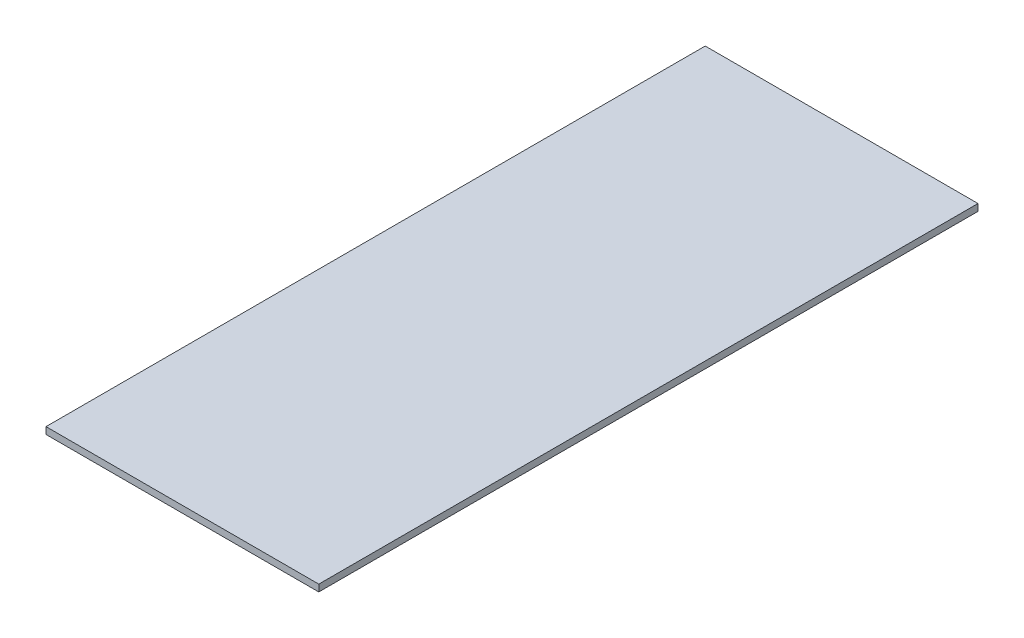
ISO-10303-21;
HEADER;
FILE_DESCRIPTION(('STEP AP214'),'2;1');
FILE_NAME('part.step','',(''),(''),'','','');
FILE_SCHEMA(('AUTOMOTIVE_DESIGN { 1 0 10303 214 1 1 1 1 }'));
ENDSEC;
DATA;
#1=APPLICATION_CONTEXT('core data for automotive mechanical design processes');
#2=APPLICATION_PROTOCOL_DEFINITION('international standard','automotive_design',2000,#1);
#3=PRODUCT_CONTEXT('',#1,'mechanical');
#4=PRODUCT('Part','Part','',(#3));
#5=PRODUCT_RELATED_PRODUCT_CATEGORY('part','',(#4));
#6=PRODUCT_DEFINITION_FORMATION('','',#4);
#7=PRODUCT_DEFINITION_CONTEXT('part definition',#1,'design');
#8=PRODUCT_DEFINITION('design','',#6,#7);
#9=PRODUCT_DEFINITION_SHAPE('','',#8);
#10=(LENGTH_UNIT() NAMED_UNIT(*) SI_UNIT(.MILLI.,.METRE.));
#11=(NAMED_UNIT(*) PLANE_ANGLE_UNIT() SI_UNIT($,.RADIAN.));
#12=(NAMED_UNIT(*) SI_UNIT($,.STERADIAN.) SOLID_ANGLE_UNIT());
#13=UNCERTAINTY_MEASURE_WITH_UNIT(LENGTH_MEASURE(1.E-05),#10,'distance_accuracy_value','');
#14=(GEOMETRIC_REPRESENTATION_CONTEXT(3) GLOBAL_UNCERTAINTY_ASSIGNED_CONTEXT((#13)) GLOBAL_UNIT_ASSIGNED_CONTEXT((#10,
#11,#12)) REPRESENTATION_CONTEXT('',''));
#15=CARTESIAN_POINT('',(0.,0.,0.));
#16=DIRECTION('',(0.,0.,1.));
#17=DIRECTION('',(1.,0.,0.));
#18=AXIS2_PLACEMENT_3D('',#15,#16,#17);
#19=CARTESIAN_POINT('',(-44.040471128325,3.,-45.34731003421));
#20=DIRECTION('',(1.,0.,0.));
#21=DIRECTION('',(0.,0.,-1.));
#22=AXIS2_PLACEMENT_3D('',#19,#20,#21);
#23=PLANE('',#22);
#24=DIRECTION('',(0.,0.,1.));
#25=VECTOR('',#24,1.);
#26=CARTESIAN_POINT('',(-44.040471128325,0.,-45.34731003421));
#27=LINE('',#26,#25);
#28=CARTESIAN_POINT('',(-44.040471128325,0.,-45.34731003421));
#29=VERTEX_POINT('',#28);
#30=CARTESIAN_POINT('',(-44.040471128325,0.,244.65268996579));
#31=VERTEX_POINT('',#30);
#32=EDGE_CURVE('E104',#29,#31,#27,.T.);
#33=ORIENTED_EDGE('',*,*,#32,.T.);
#34=DIRECTION('',(0.,-1.,0.));
#35=VECTOR('',#34,1.);
#36=CARTESIAN_POINT('',(-44.040471128325,3.,244.65268996579));
#37=LINE('',#36,#35);
#38=CARTESIAN_POINT('',(-44.040471128325,3.,244.65268996579));
#39=VERTEX_POINT('',#38);
#40=EDGE_CURVE('E11',#39,#31,#37,.T.);
#41=ORIENTED_EDGE('',*,*,#40,.F.);
#42=DIRECTION('',(0.,0.,1.));
#43=VECTOR('',#42,1.);
#44=CARTESIAN_POINT('',(-44.040471128325,3.,-45.34731003421));
#45=LINE('',#44,#43);
#46=CARTESIAN_POINT('',(-44.040471128325,3.,-45.34731003421));
#47=VERTEX_POINT('',#46);
#48=EDGE_CURVE('E92',#47,#39,#45,.T.);
#49=ORIENTED_EDGE('',*,*,#48,.F.);
#50=DIRECTION('',(0.,-1.,0.));
#51=VECTOR('',#50,1.);
#52=CARTESIAN_POINT('',(-44.040471128325,3.,-45.34731003421));
#53=LINE('',#52,#51);
#54=EDGE_CURVE('E100',#47,#29,#53,.T.);
#55=ORIENTED_EDGE('',*,*,#54,.T.);
#56=EDGE_LOOP('',(#33,#41,#49,#55));
#57=FACE_BOUND('',#56,.T.);
#58=ADVANCED_FACE('F41',(#57),#23,.F.);
#59=CARTESIAN_POINT('',(-44.040471128325,3.,244.65268996579));
#60=DIRECTION('',(0.,0.,-1.));
#61=DIRECTION('',(-1.,0.,0.));
#62=AXIS2_PLACEMENT_3D('',#59,#60,#61);
#63=PLANE('',#62);
#64=DIRECTION('',(1.,0.,0.));
#65=VECTOR('',#64,1.);
#66=CARTESIAN_POINT('',(-44.040471128325,0.,244.65268996579));
#67=LINE('',#66,#65);
#68=CARTESIAN_POINT('',(75.959528871675,0.,244.65268996579));
#69=VERTEX_POINT('',#68);
#70=EDGE_CURVE('E96',#31,#69,#67,.T.);
#71=ORIENTED_EDGE('',*,*,#70,.T.);
#72=DIRECTION('',(0.,-1.,0.));
#73=VECTOR('',#72,1.);
#74=CARTESIAN_POINT('',(75.959528871675,3.,244.65268996579));
#75=LINE('',#74,#73);
#76=CARTESIAN_POINT('',(75.959528871675,3.,244.65268996579));
#77=VERTEX_POINT('',#76);
#78=EDGE_CURVE('E49',#77,#69,#75,.T.);
#79=ORIENTED_EDGE('',*,*,#78,.F.);
#80=DIRECTION('',(1.,0.,0.));
#81=VECTOR('',#80,1.);
#82=CARTESIAN_POINT('',(-44.040471128325,3.,244.65268996579));
#83=LINE('',#82,#81);
#84=EDGE_CURVE('E87',#39,#77,#83,.T.);
#85=ORIENTED_EDGE('',*,*,#84,.F.);
#86=ORIENTED_EDGE('',*,*,#40,.T.);
#87=EDGE_LOOP('',(#71,#79,#85,#86));
#88=FACE_BOUND('',#87,.T.);
#89=ADVANCED_FACE('F95',(#88),#63,.F.);
#90=CARTESIAN_POINT('',(75.9595288716749,3.,-45.34731003421));
#91=DIRECTION('',(-1.,0.,0.));
#92=DIRECTION('',(0.,0.,1.));
#93=AXIS2_PLACEMENT_3D('',#90,#91,#92);
#94=PLANE('',#93);
#95=DIRECTION('',(0.,0.,-1.));
#96=VECTOR('',#95,1.);
#97=CARTESIAN_POINT('',(75.9595288716749,0.,-45.34731003421));
#98=LINE('',#97,#96);
#99=CARTESIAN_POINT('',(75.9595288716749,0.,-45.34731003421));
#100=VERTEX_POINT('',#99);
#101=EDGE_CURVE('E74',#69,#100,#98,.T.);
#102=ORIENTED_EDGE('',*,*,#101,.T.);
#103=DIRECTION('',(0.,-1.,0.));
#104=VECTOR('',#103,1.);
#105=CARTESIAN_POINT('',(75.9595288716749,3.,-45.34731003421));
#106=LINE('',#105,#104);
#107=CARTESIAN_POINT('',(75.9595288716749,3.,-45.34731003421));
#108=VERTEX_POINT('',#107);
#109=EDGE_CURVE('E97',#108,#100,#106,.T.);
#110=ORIENTED_EDGE('',*,*,#109,.F.);
#111=DIRECTION('',(0.,0.,-1.));
#112=VECTOR('',#111,1.);
#113=CARTESIAN_POINT('',(75.9595288716749,3.,-45.34731003421));
#114=LINE('',#113,#112);
#115=EDGE_CURVE('E90',#77,#108,#114,.T.);
#116=ORIENTED_EDGE('',*,*,#115,.F.);
#117=ORIENTED_EDGE('',*,*,#78,.T.);
#118=EDGE_LOOP('',(#102,#110,#116,#117));
#119=FACE_BOUND('',#118,.T.);
#120=ADVANCED_FACE('F98',(#119),#94,.F.);
#121=CARTESIAN_POINT('',(-44.040471128325,3.,-45.34731003421));
#122=DIRECTION('',(0.,0.,1.));
#123=DIRECTION('',(1.,0.,0.));
#124=AXIS2_PLACEMENT_3D('',#121,#122,#123);
#125=PLANE('',#124);
#126=DIRECTION('',(-1.,0.,0.));
#127=VECTOR('',#126,1.);
#128=CARTESIAN_POINT('',(-44.040471128325,0.,-45.34731003421));
#129=LINE('',#128,#127);
#130=EDGE_CURVE('E80',#100,#29,#129,.T.);
#131=ORIENTED_EDGE('',*,*,#130,.T.);
#132=ORIENTED_EDGE('',*,*,#54,.F.);
#133=DIRECTION('',(-1.,0.,0.));
#134=VECTOR('',#133,1.);
#135=CARTESIAN_POINT('',(-44.040471128325,3.,-45.34731003421));
#136=LINE('',#135,#134);
#137=EDGE_CURVE('E57',#108,#47,#136,.T.);
#138=ORIENTED_EDGE('',*,*,#137,.F.);
#139=ORIENTED_EDGE('',*,*,#109,.T.);
#140=EDGE_LOOP('',(#131,#132,#138,#139));
#141=FACE_BOUND('',#140,.T.);
#142=ADVANCED_FACE('F111',(#141),#125,.F.);
#143=CARTESIAN_POINT('',(0.,3.,0.));
#144=DIRECTION('',(0.,1.,0.));
#145=DIRECTION('',(0.,0.,1.));
#146=AXIS2_PLACEMENT_3D('',#143,#144,#145);
#147=PLANE('',#146);
#148=ORIENTED_EDGE('',*,*,#48,.T.);
#149=ORIENTED_EDGE('',*,*,#84,.T.);
#150=ORIENTED_EDGE('',*,*,#115,.T.);
#151=ORIENTED_EDGE('',*,*,#137,.T.);
#152=EDGE_LOOP('',(#148,#149,#150,#151));
#153=FACE_BOUND('',#152,.T.);
#154=ADVANCED_FACE('F88',(#153),#147,.T.);
#155=CARTESIAN_POINT('',(0.,0.,0.));
#156=DIRECTION('',(0.,1.,0.));
#157=DIRECTION('',(0.,0.,1.));
#158=AXIS2_PLACEMENT_3D('',#155,#156,#157);
#159=PLANE('',#158);
#160=ORIENTED_EDGE('',*,*,#32,.F.);
#161=ORIENTED_EDGE('',*,*,#130,.F.);
#162=ORIENTED_EDGE('',*,*,#101,.F.);
#163=ORIENTED_EDGE('',*,*,#70,.F.);
#164=EDGE_LOOP('',(#160,#161,#162,#163));
#165=FACE_BOUND('',#164,.T.);
#166=ADVANCED_FACE('F114',(#165),#159,.F.);
#167=CLOSED_SHELL('',(#58,#89,#120,#142,#154,#166));
#168=MANIFOLD_SOLID_BREP('B2',#167);
#169=ADVANCED_BREP_SHAPE_REPRESENTATION('',(#18,#168),#14);
#170=SHAPE_DEFINITION_REPRESENTATION(#9,#169);
ENDSEC;
END-ISO-10303-21;
